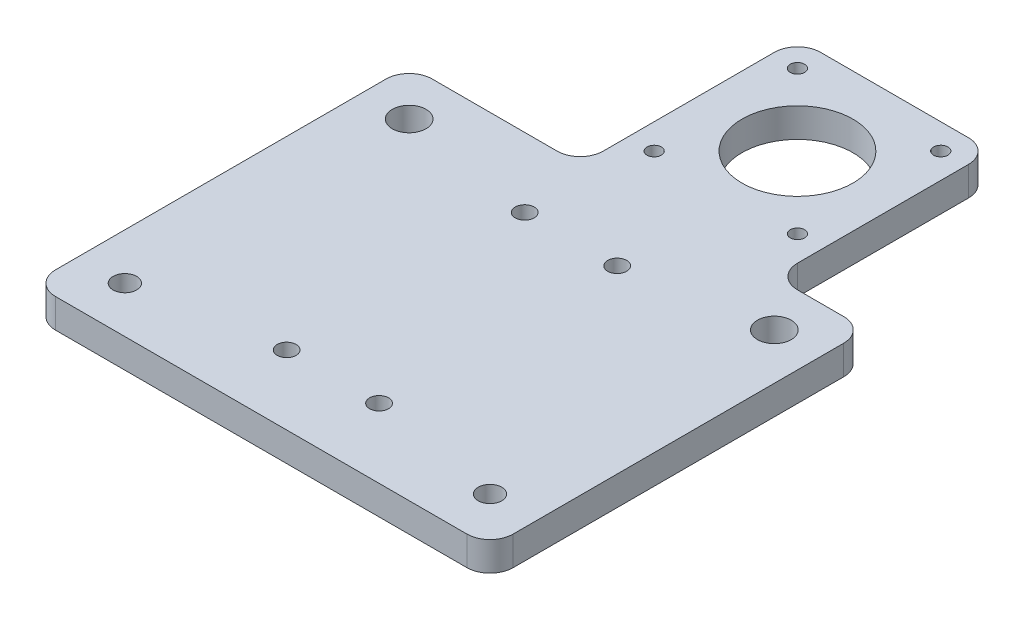
ISO-10303-21;
HEADER;
FILE_DESCRIPTION(('STEP AP214'),'2;1');
FILE_NAME('part.step','',(''),(''),'','','');
FILE_SCHEMA(('AUTOMOTIVE_DESIGN { 1 0 10303 214 1 1 1 1 }'));
ENDSEC;
DATA;
#1=APPLICATION_CONTEXT('core data for automotive mechanical design processes');
#2=APPLICATION_PROTOCOL_DEFINITION('international standard','automotive_design',2000,#1);
#3=PRODUCT_CONTEXT('',#1,'mechanical');
#4=PRODUCT('Part','Part','',(#3));
#5=PRODUCT_RELATED_PRODUCT_CATEGORY('part','',(#4));
#6=PRODUCT_DEFINITION_FORMATION('','',#4);
#7=PRODUCT_DEFINITION_CONTEXT('part definition',#1,'design');
#8=PRODUCT_DEFINITION('design','',#6,#7);
#9=PRODUCT_DEFINITION_SHAPE('','',#8);
#10=(LENGTH_UNIT() NAMED_UNIT(*) SI_UNIT(.MILLI.,.METRE.));
#11=(NAMED_UNIT(*) PLANE_ANGLE_UNIT() SI_UNIT($,.RADIAN.));
#12=(NAMED_UNIT(*) SI_UNIT($,.STERADIAN.) SOLID_ANGLE_UNIT());
#13=UNCERTAINTY_MEASURE_WITH_UNIT(LENGTH_MEASURE(1.E-05),#10,'distance_accuracy_value','');
#14=(GEOMETRIC_REPRESENTATION_CONTEXT(3) GLOBAL_UNCERTAINTY_ASSIGNED_CONTEXT((#13)) GLOBAL_UNIT_ASSIGNED_CONTEXT((#10,
#11,#12)) REPRESENTATION_CONTEXT('',''));
#15=CARTESIAN_POINT('',(0.,0.,0.));
#16=DIRECTION('',(0.,0.,1.));
#17=DIRECTION('',(1.,0.,0.));
#18=AXIS2_PLACEMENT_3D('',#15,#16,#17);
#19=CARTESIAN_POINT('',(0.,6.3,0.));
#20=DIRECTION('',(0.,1.,0.));
#21=DIRECTION('',(0.,0.,1.));
#22=AXIS2_PLACEMENT_3D('',#19,#20,#21);
#23=PLANE('',#22);
#24=CARTESIAN_POINT('',(60.,6.3,-15.));
#25=DIRECTION('',(0.,1.,0.));
#26=DIRECTION('',(0.,0.,1.));
#27=AXIS2_PLACEMENT_3D('',#24,#25,#26);
#28=CIRCLE('',#27,2.04999999999999);
#29=CARTESIAN_POINT('',(60.,6.3,-12.95));
#30=VERTEX_POINT('',#29);
#31=EDGE_CURVE('E348',#30,#30,#28,.T.);
#32=ORIENTED_EDGE('',*,*,#31,.F.);
#33=EDGE_LOOP('',(#32));
#34=FACE_BOUND('',#33,.T.);
#35=CARTESIAN_POINT('',(40.,6.3,-66.5));
#36=DIRECTION('',(0.,1.,0.));
#37=DIRECTION('',(0.,0.,1.));
#38=AXIS2_PLACEMENT_3D('',#35,#36,#37);
#39=CIRCLE('',#38,2.05);
#40=CARTESIAN_POINT('',(40.,6.3,-64.45));
#41=VERTEX_POINT('',#40);
#42=EDGE_CURVE('E336',#41,#41,#39,.T.);
#43=ORIENTED_EDGE('',*,*,#42,.F.);
#44=EDGE_LOOP('',(#43));
#45=FACE_BOUND('',#44,.T.);
#46=CARTESIAN_POINT('',(89.,6.3,-10.));
#47=DIRECTION('',(0.,1.,0.));
#48=DIRECTION('',(0.,0.,1.));
#49=AXIS2_PLACEMENT_3D('',#46,#47,#48);
#50=CIRCLE('',#49,2.54999999999999);
#51=CARTESIAN_POINT('',(89.,6.3,-7.45000000000001));
#52=VERTEX_POINT('',#51);
#53=EDGE_CURVE('E324',#52,#52,#50,.T.);
#54=ORIENTED_EDGE('',*,*,#53,.F.);
#55=EDGE_LOOP('',(#54));
#56=FACE_BOUND('',#55,.T.);
#57=CARTESIAN_POINT('',(42.5,6.3,-92.));
#58=DIRECTION('',(0.,1.,0.));
#59=DIRECTION('',(0.,0.,1.));
#60=AXIS2_PLACEMENT_3D('',#57,#58,#59);
#61=CIRCLE('',#60,1.54999999999999);
#62=CARTESIAN_POINT('',(42.5,6.3,-90.45));
#63=VERTEX_POINT('',#62);
#64=EDGE_CURVE('E312',#63,#63,#61,.T.);
#65=ORIENTED_EDGE('',*,*,#64,.F.);
#66=EDGE_LOOP('',(#65));
#67=FACE_BOUND('',#66,.T.);
#68=CARTESIAN_POINT('',(73.5,6.3,-123.));
#69=DIRECTION('',(0.,1.,0.));
#70=DIRECTION('',(0.,0.,1.));
#71=AXIS2_PLACEMENT_3D('',#68,#69,#70);
#72=CIRCLE('',#71,1.54999999999999);
#73=CARTESIAN_POINT('',(73.5,6.3,-121.45));
#74=VERTEX_POINT('',#73);
#75=EDGE_CURVE('E300',#74,#74,#72,.T.);
#76=ORIENTED_EDGE('',*,*,#75,.F.);
#77=EDGE_LOOP('',(#76));
#78=FACE_BOUND('',#77,.T.);
#79=CARTESIAN_POINT('',(58.,6.3,-107.5));
#80=DIRECTION('',(0.,1.,0.));
#81=DIRECTION('',(0.,0.,1.));
#82=AXIS2_PLACEMENT_3D('',#79,#80,#81);
#83=CIRCLE('',#82,12.);
#84=CARTESIAN_POINT('',(58.,6.3,-95.5));
#85=VERTEX_POINT('',#84);
#86=EDGE_CURVE('E288',#85,#85,#83,.T.);
#87=ORIENTED_EDGE('',*,*,#86,.F.);
#88=EDGE_LOOP('',(#87));
#89=FACE_BOUND('',#88,.T.);
#90=DIRECTION('',(0.,0.,1.));
#91=VECTOR('',#90,1.);
#92=CARTESIAN_POINT('',(0.,6.3,0.));
#93=LINE('',#92,#91);
#94=CARTESIAN_POINT('',(0.,6.3,-76.5));
#95=VERTEX_POINT('',#94);
#96=CARTESIAN_POINT('',(0.,6.3,-5.));
#97=VERTEX_POINT('',#96);
#98=EDGE_CURVE('E197',#95,#97,#93,.T.);
#99=ORIENTED_EDGE('',*,*,#98,.T.);
#100=CARTESIAN_POINT('',(5.,6.3,-5.));
#101=DIRECTION('',(0.,1.,0.));
#102=DIRECTION('',(0.,0.,1.));
#103=AXIS2_PLACEMENT_3D('',#100,#101,#102);
#104=CIRCLE('',#103,5.);
#105=CARTESIAN_POINT('',(5.,6.3,0.));
#106=VERTEX_POINT('',#105);
#107=EDGE_CURVE('E221',#97,#106,#104,.T.);
#108=ORIENTED_EDGE('',*,*,#107,.T.);
#109=DIRECTION('',(1.,0.,0.));
#110=VECTOR('',#109,1.);
#111=CARTESIAN_POINT('',(0.,6.3,0.));
#112=LINE('',#111,#110);
#113=CARTESIAN_POINT('',(94.,6.3,0.));
#114=VERTEX_POINT('',#113);
#115=EDGE_CURVE('E167',#106,#114,#112,.T.);
#116=ORIENTED_EDGE('',*,*,#115,.T.);
#117=CARTESIAN_POINT('',(94.,6.3,-5.));
#118=DIRECTION('',(0.,1.,0.));
#119=DIRECTION('',(0.,0.,1.));
#120=AXIS2_PLACEMENT_3D('',#117,#118,#119);
#121=CIRCLE('',#120,5.);
#122=CARTESIAN_POINT('',(99.,6.3,-5.));
#123=VERTEX_POINT('',#122);
#124=EDGE_CURVE('E219',#114,#123,#121,.T.);
#125=ORIENTED_EDGE('',*,*,#124,.T.);
#126=DIRECTION('',(0.,0.,-1.));
#127=VECTOR('',#126,1.);
#128=CARTESIAN_POINT('',(99.,6.3,0.));
#129=LINE('',#128,#127);
#130=CARTESIAN_POINT('',(99.,6.3,-76.5));
#131=VERTEX_POINT('',#130);
#132=EDGE_CURVE('E279',#123,#131,#129,.T.);
#133=ORIENTED_EDGE('',*,*,#132,.T.);
#134=CARTESIAN_POINT('',(94.,6.3,-76.5));
#135=DIRECTION('',(0.,1.,0.));
#136=DIRECTION('',(0.,0.,1.));
#137=AXIS2_PLACEMENT_3D('',#134,#135,#136);
#138=CIRCLE('',#137,5.);
#139=CARTESIAN_POINT('',(94.,6.3,-81.5));
#140=VERTEX_POINT('',#139);
#141=EDGE_CURVE('E217',#131,#140,#138,.T.);
#142=ORIENTED_EDGE('',*,*,#141,.T.);
#143=DIRECTION('',(-1.,0.,0.));
#144=VECTOR('',#143,1.);
#145=CARTESIAN_POINT('',(79.,6.3,-81.5));
#146=LINE('',#145,#144);
#147=CARTESIAN_POINT('',(84.,6.3,-81.5));
#148=VERTEX_POINT('',#147);
#149=EDGE_CURVE('E276',#140,#148,#146,.T.);
#150=ORIENTED_EDGE('',*,*,#149,.T.);
#151=CARTESIAN_POINT('',(84.,6.3,-86.5));
#152=DIRECTION('',(0.,1.,0.));
#153=DIRECTION('',(0.,0.,1.));
#154=AXIS2_PLACEMENT_3D('',#151,#152,#153);
#155=CIRCLE('',#154,5.);
#156=CARTESIAN_POINT('',(79.,6.3,-86.5));
#157=VERTEX_POINT('',#156);
#158=EDGE_CURVE('E254',#148,#157,#155,.F.);
#159=ORIENTED_EDGE('',*,*,#158,.T.);
#160=DIRECTION('',(0.,0.,-1.));
#161=VECTOR('',#160,1.);
#162=CARTESIAN_POINT('',(79.,6.3,-81.5));
#163=LINE('',#162,#161);
#164=CARTESIAN_POINT('',(79.,6.3,-123.5));
#165=VERTEX_POINT('',#164);
#166=EDGE_CURVE('E273',#157,#165,#163,.T.);
#167=ORIENTED_EDGE('',*,*,#166,.T.);
#168=CARTESIAN_POINT('',(74.,6.3,-123.5));
#169=DIRECTION('',(0.,1.,0.));
#170=DIRECTION('',(0.,0.,1.));
#171=AXIS2_PLACEMENT_3D('',#168,#169,#170);
#172=CIRCLE('',#171,5.);
#173=CARTESIAN_POINT('',(74.,6.3,-128.5));
#174=VERTEX_POINT('',#173);
#175=EDGE_CURVE('E215',#165,#174,#172,.T.);
#176=ORIENTED_EDGE('',*,*,#175,.T.);
#177=DIRECTION('',(-1.,0.,0.));
#178=VECTOR('',#177,1.);
#179=CARTESIAN_POINT('',(37.,6.3,-128.5));
#180=LINE('',#179,#178);
#181=CARTESIAN_POINT('',(42.,6.3,-128.5));
#182=VERTEX_POINT('',#181);
#183=EDGE_CURVE('E268',#174,#182,#180,.T.);
#184=ORIENTED_EDGE('',*,*,#183,.T.);
#185=CARTESIAN_POINT('',(42.,6.3,-123.5));
#186=DIRECTION('',(0.,1.,0.));
#187=DIRECTION('',(0.,0.,1.));
#188=AXIS2_PLACEMENT_3D('',#185,#186,#187);
#189=CIRCLE('',#188,5.);
#190=CARTESIAN_POINT('',(37.,6.3,-123.5));
#191=VERTEX_POINT('',#190);
#192=EDGE_CURVE('E213',#182,#191,#189,.T.);
#193=ORIENTED_EDGE('',*,*,#192,.T.);
#194=DIRECTION('',(0.,0.,1.));
#195=VECTOR('',#194,1.);
#196=CARTESIAN_POINT('',(37.,6.3,-81.5));
#197=LINE('',#196,#195);
#198=CARTESIAN_POINT('',(37.,6.3,-86.5));
#199=VERTEX_POINT('',#198);
#200=EDGE_CURVE('E267',#191,#199,#197,.T.);
#201=ORIENTED_EDGE('',*,*,#200,.T.);
#202=CARTESIAN_POINT('',(32.,6.3,-86.5));
#203=DIRECTION('',(0.,1.,0.));
#204=DIRECTION('',(0.,0.,1.));
#205=AXIS2_PLACEMENT_3D('',#202,#203,#204);
#206=CIRCLE('',#205,5.);
#207=CARTESIAN_POINT('',(32.,6.3,-81.5));
#208=VERTEX_POINT('',#207);
#209=EDGE_CURVE('E11',#199,#208,#206,.F.);
#210=ORIENTED_EDGE('',*,*,#209,.T.);
#211=DIRECTION('',(-1.,0.,0.));
#212=VECTOR('',#211,1.);
#213=CARTESIAN_POINT('',(37.,6.3,-81.5));
#214=LINE('',#213,#212);
#215=CARTESIAN_POINT('',(5.,6.3,-81.5));
#216=VERTEX_POINT('',#215);
#217=EDGE_CURVE('E198',#208,#216,#214,.T.);
#218=ORIENTED_EDGE('',*,*,#217,.T.);
#219=CARTESIAN_POINT('',(5.,6.3,-76.5));
#220=DIRECTION('',(0.,1.,0.));
#221=DIRECTION('',(0.,0.,1.));
#222=AXIS2_PLACEMENT_3D('',#219,#220,#221);
#223=CIRCLE('',#222,5.);
#224=EDGE_CURVE('E211',#216,#95,#223,.T.);
#225=ORIENTED_EDGE('',*,*,#224,.T.);
#226=EDGE_LOOP('',(#99,#108,#116,#125,#133,#142,#150,#159,#167,#176,#184,#193,#201,#210,#218,#225));
#227=FACE_BOUND('',#226,.T.);
#228=CARTESIAN_POINT('',(10.,6.3,-71.5));
#229=DIRECTION('',(0.,1.,0.));
#230=DIRECTION('',(0.,0.,1.));
#231=AXIS2_PLACEMENT_3D('',#228,#229,#230);
#232=CIRCLE('',#231,3.65);
#233=CARTESIAN_POINT('',(10.,6.3,-67.85));
#234=VERTEX_POINT('',#233);
#235=EDGE_CURVE('E180',#234,#234,#232,.T.);
#236=ORIENTED_EDGE('',*,*,#235,.F.);
#237=EDGE_LOOP('',(#236));
#238=FACE_BOUND('',#237,.T.);
#239=CARTESIAN_POINT('',(42.5,6.3,-123.));
#240=DIRECTION('',(0.,1.,0.));
#241=DIRECTION('',(0.,0.,1.));
#242=AXIS2_PLACEMENT_3D('',#239,#240,#241);
#243=CIRCLE('',#242,1.55);
#244=CARTESIAN_POINT('',(42.5,6.3,-121.45));
#245=VERTEX_POINT('',#244);
#246=EDGE_CURVE('E294',#245,#245,#243,.T.);
#247=ORIENTED_EDGE('',*,*,#246,.F.);
#248=EDGE_LOOP('',(#247));
#249=FACE_BOUND('',#248,.T.);
#250=CARTESIAN_POINT('',(73.5,6.3,-92.));
#251=DIRECTION('',(0.,1.,0.));
#252=DIRECTION('',(0.,0.,1.));
#253=AXIS2_PLACEMENT_3D('',#250,#251,#252);
#254=CIRCLE('',#253,1.54999999999999);
#255=CARTESIAN_POINT('',(73.5,6.3,-90.45));
#256=VERTEX_POINT('',#255);
#257=EDGE_CURVE('E306',#256,#256,#254,.T.);
#258=ORIENTED_EDGE('',*,*,#257,.F.);
#259=EDGE_LOOP('',(#258));
#260=FACE_BOUND('',#259,.T.);
#261=CARTESIAN_POINT('',(89.,6.3,-71.5));
#262=DIRECTION('',(0.,1.,0.));
#263=DIRECTION('',(0.,0.,1.));
#264=AXIS2_PLACEMENT_3D('',#261,#262,#263);
#265=CIRCLE('',#264,3.65);
#266=CARTESIAN_POINT('',(89.,6.3,-67.85));
#267=VERTEX_POINT('',#266);
#268=EDGE_CURVE('E318',#267,#267,#265,.T.);
#269=ORIENTED_EDGE('',*,*,#268,.F.);
#270=EDGE_LOOP('',(#269));
#271=FACE_BOUND('',#270,.T.);
#272=CARTESIAN_POINT('',(10.,6.3,-9.99999999999999));
#273=DIRECTION('',(0.,1.,0.));
#274=DIRECTION('',(0.,0.,1.));
#275=AXIS2_PLACEMENT_3D('',#272,#273,#274);
#276=CIRCLE('',#275,2.55);
#277=CARTESIAN_POINT('',(10.,6.3,-7.44999999999999));
#278=VERTEX_POINT('',#277);
#279=EDGE_CURVE('E330',#278,#278,#276,.T.);
#280=ORIENTED_EDGE('',*,*,#279,.F.);
#281=EDGE_LOOP('',(#280));
#282=FACE_BOUND('',#281,.T.);
#283=CARTESIAN_POINT('',(60.,6.3,-66.5));
#284=DIRECTION('',(0.,1.,0.));
#285=DIRECTION('',(0.,0.,1.));
#286=AXIS2_PLACEMENT_3D('',#283,#284,#285);
#287=CIRCLE('',#286,2.05);
#288=CARTESIAN_POINT('',(60.,6.3,-64.45));
#289=VERTEX_POINT('',#288);
#290=EDGE_CURVE('E342',#289,#289,#287,.T.);
#291=ORIENTED_EDGE('',*,*,#290,.F.);
#292=EDGE_LOOP('',(#291));
#293=FACE_BOUND('',#292,.T.);
#294=CARTESIAN_POINT('',(40.,6.3,-15.));
#295=DIRECTION('',(0.,1.,0.));
#296=DIRECTION('',(0.,0.,1.));
#297=AXIS2_PLACEMENT_3D('',#294,#295,#296);
#298=CIRCLE('',#297,2.05);
#299=CARTESIAN_POINT('',(40.,6.3,-12.95));
#300=VERTEX_POINT('',#299);
#301=EDGE_CURVE('E354',#300,#300,#298,.T.);
#302=ORIENTED_EDGE('',*,*,#301,.F.);
#303=EDGE_LOOP('',(#302));
#304=FACE_BOUND('',#303,.T.);
#305=ADVANCED_FACE('F34',(#34,#45,#56,#67,#78,#89,#227,#238,#249,#260,#271,#282,#293,#304),#23,.T.);
#306=CARTESIAN_POINT('',(0.,0.,0.));
#307=DIRECTION('',(0.,1.,0.));
#308=DIRECTION('',(0.,0.,1.));
#309=AXIS2_PLACEMENT_3D('',#306,#307,#308);
#310=PLANE('',#309);
#311=DIRECTION('',(1.,0.,0.));
#312=VECTOR('',#311,1.);
#313=CARTESIAN_POINT('',(0.,0.,0.));
#314=LINE('',#313,#312);
#315=CARTESIAN_POINT('',(5.,0.,0.));
#316=VERTEX_POINT('',#315);
#317=CARTESIAN_POINT('',(94.,0.,0.));
#318=VERTEX_POINT('',#317);
#319=EDGE_CURVE('E164',#316,#318,#314,.T.);
#320=ORIENTED_EDGE('',*,*,#319,.F.);
#321=CARTESIAN_POINT('',(5.,0.,-5.));
#322=DIRECTION('',(0.,1.,0.));
#323=DIRECTION('',(0.,0.,1.));
#324=AXIS2_PLACEMENT_3D('',#321,#322,#323);
#325=CIRCLE('',#324,5.);
#326=CARTESIAN_POINT('',(0.,0.,-5.));
#327=VERTEX_POINT('',#326);
#328=EDGE_CURVE('E147',#316,#327,#325,.F.);
#329=ORIENTED_EDGE('',*,*,#328,.T.);
#330=DIRECTION('',(0.,0.,1.));
#331=VECTOR('',#330,1.);
#332=CARTESIAN_POINT('',(0.,0.,0.));
#333=LINE('',#332,#331);
#334=CARTESIAN_POINT('',(0.,0.,-76.5));
#335=VERTEX_POINT('',#334);
#336=EDGE_CURVE('E175',#335,#327,#333,.T.);
#337=ORIENTED_EDGE('',*,*,#336,.F.);
#338=CARTESIAN_POINT('',(5.,0.,-76.5));
#339=DIRECTION('',(0.,1.,0.));
#340=DIRECTION('',(0.,0.,1.));
#341=AXIS2_PLACEMENT_3D('',#338,#339,#340);
#342=CIRCLE('',#341,5.);
#343=CARTESIAN_POINT('',(5.,0.,-81.5));
#344=VERTEX_POINT('',#343);
#345=EDGE_CURVE('E168',#335,#344,#342,.F.);
#346=ORIENTED_EDGE('',*,*,#345,.T.);
#347=DIRECTION('',(-1.,0.,0.));
#348=VECTOR('',#347,1.);
#349=CARTESIAN_POINT('',(37.,0.,-81.5));
#350=LINE('',#349,#348);
#351=CARTESIAN_POINT('',(32.,0.,-81.5));
#352=VERTEX_POINT('',#351);
#353=EDGE_CURVE('E195',#352,#344,#350,.T.);
#354=ORIENTED_EDGE('',*,*,#353,.F.);
#355=CARTESIAN_POINT('',(32.,0.,-86.5));
#356=DIRECTION('',(0.,1.,0.));
#357=DIRECTION('',(0.,0.,1.));
#358=AXIS2_PLACEMENT_3D('',#355,#356,#357);
#359=CIRCLE('',#358,5.);
#360=CARTESIAN_POINT('',(37.,0.,-86.5));
#361=VERTEX_POINT('',#360);
#362=EDGE_CURVE('E42',#352,#361,#359,.T.);
#363=ORIENTED_EDGE('',*,*,#362,.T.);
#364=DIRECTION('',(0.,0.,1.));
#365=VECTOR('',#364,1.);
#366=CARTESIAN_POINT('',(37.,0.,-81.5));
#367=LINE('',#366,#365);
#368=CARTESIAN_POINT('',(37.,0.,-123.5));
#369=VERTEX_POINT('',#368);
#370=EDGE_CURVE('E192',#369,#361,#367,.T.);
#371=ORIENTED_EDGE('',*,*,#370,.F.);
#372=CARTESIAN_POINT('',(42.,0.,-123.5));
#373=DIRECTION('',(0.,1.,0.));
#374=DIRECTION('',(0.,0.,1.));
#375=AXIS2_PLACEMENT_3D('',#372,#373,#374);
#376=CIRCLE('',#375,5.);
#377=CARTESIAN_POINT('',(42.,0.,-128.5));
#378=VERTEX_POINT('',#377);
#379=EDGE_CURVE('E201',#369,#378,#376,.F.);
#380=ORIENTED_EDGE('',*,*,#379,.T.);
#381=DIRECTION('',(-1.,0.,0.));
#382=VECTOR('',#381,1.);
#383=CARTESIAN_POINT('',(37.,0.,-128.5));
#384=LINE('',#383,#382);
#385=CARTESIAN_POINT('',(74.,0.,-128.5));
#386=VERTEX_POINT('',#385);
#387=EDGE_CURVE('E189',#386,#378,#384,.T.);
#388=ORIENTED_EDGE('',*,*,#387,.F.);
#389=CARTESIAN_POINT('',(74.,0.,-123.5));
#390=DIRECTION('',(0.,1.,0.));
#391=DIRECTION('',(0.,0.,1.));
#392=AXIS2_PLACEMENT_3D('',#389,#390,#391);
#393=CIRCLE('',#392,5.);
#394=CARTESIAN_POINT('',(79.,0.,-123.5));
#395=VERTEX_POINT('',#394);
#396=EDGE_CURVE('E203',#386,#395,#393,.F.);
#397=ORIENTED_EDGE('',*,*,#396,.T.);
#398=DIRECTION('',(0.,0.,-1.));
#399=VECTOR('',#398,1.);
#400=CARTESIAN_POINT('',(79.,0.,-81.5));
#401=LINE('',#400,#399);
#402=CARTESIAN_POINT('',(79.,0.,-86.5));
#403=VERTEX_POINT('',#402);
#404=EDGE_CURVE('E186',#403,#395,#401,.T.);
#405=ORIENTED_EDGE('',*,*,#404,.F.);
#406=CARTESIAN_POINT('',(84.,0.,-86.5));
#407=DIRECTION('',(0.,1.,0.));
#408=DIRECTION('',(0.,0.,1.));
#409=AXIS2_PLACEMENT_3D('',#406,#407,#408);
#410=CIRCLE('',#409,5.);
#411=CARTESIAN_POINT('',(84.,0.,-81.5));
#412=VERTEX_POINT('',#411);
#413=EDGE_CURVE('E252',#403,#412,#410,.T.);
#414=ORIENTED_EDGE('',*,*,#413,.T.);
#415=DIRECTION('',(-1.,0.,0.));
#416=VECTOR('',#415,1.);
#417=CARTESIAN_POINT('',(79.,0.,-81.5));
#418=LINE('',#417,#416);
#419=CARTESIAN_POINT('',(94.,0.,-81.5));
#420=VERTEX_POINT('',#419);
#421=EDGE_CURVE('E178',#420,#412,#418,.T.);
#422=ORIENTED_EDGE('',*,*,#421,.F.);
#423=CARTESIAN_POINT('',(94.,0.,-76.5));
#424=DIRECTION('',(0.,1.,0.));
#425=DIRECTION('',(0.,0.,1.));
#426=AXIS2_PLACEMENT_3D('',#423,#424,#425);
#427=CIRCLE('',#426,5.);
#428=CARTESIAN_POINT('',(99.,0.,-76.5));
#429=VERTEX_POINT('',#428);
#430=EDGE_CURVE('E205',#420,#429,#427,.F.);
#431=ORIENTED_EDGE('',*,*,#430,.T.);
#432=DIRECTION('',(0.,0.,-1.));
#433=VECTOR('',#432,1.);
#434=CARTESIAN_POINT('',(99.,0.,0.));
#435=LINE('',#434,#433);
#436=CARTESIAN_POINT('',(99.,0.,-5.));
#437=VERTEX_POINT('',#436);
#438=EDGE_CURVE('E174',#437,#429,#435,.T.);
#439=ORIENTED_EDGE('',*,*,#438,.F.);
#440=CARTESIAN_POINT('',(94.,0.,-5.));
#441=DIRECTION('',(0.,1.,0.));
#442=DIRECTION('',(0.,0.,1.));
#443=AXIS2_PLACEMENT_3D('',#440,#441,#442);
#444=CIRCLE('',#443,5.);
#445=EDGE_CURVE('E158',#437,#318,#444,.F.);
#446=ORIENTED_EDGE('',*,*,#445,.T.);
#447=EDGE_LOOP('',(#320,#329,#337,#346,#354,#363,#371,#380,#388,#397,#405,#414,#422,#431,#439,#446));
#448=FACE_BOUND('',#447,.T.);
#449=CARTESIAN_POINT('',(10.,0.,-71.5));
#450=DIRECTION('',(0.,1.,0.));
#451=DIRECTION('',(0.,0.,1.));
#452=AXIS2_PLACEMENT_3D('',#449,#450,#451);
#453=CIRCLE('',#452,3.65);
#454=CARTESIAN_POINT('',(10.,0.,-67.85));
#455=VERTEX_POINT('',#454);
#456=EDGE_CURVE('E285',#455,#455,#453,.T.);
#457=ORIENTED_EDGE('',*,*,#456,.T.);
#458=EDGE_LOOP('',(#457));
#459=FACE_BOUND('',#458,.T.);
#460=CARTESIAN_POINT('',(58.,0.,-107.5));
#461=DIRECTION('',(0.,1.,0.));
#462=DIRECTION('',(0.,0.,1.));
#463=AXIS2_PLACEMENT_3D('',#460,#461,#462);
#464=CIRCLE('',#463,12.);
#465=CARTESIAN_POINT('',(58.,0.,-95.5));
#466=VERTEX_POINT('',#465);
#467=EDGE_CURVE('E291',#466,#466,#464,.T.);
#468=ORIENTED_EDGE('',*,*,#467,.T.);
#469=EDGE_LOOP('',(#468));
#470=FACE_BOUND('',#469,.T.);
#471=CARTESIAN_POINT('',(42.5,0.,-123.));
#472=DIRECTION('',(0.,1.,0.));
#473=DIRECTION('',(0.,0.,1.));
#474=AXIS2_PLACEMENT_3D('',#471,#472,#473);
#475=CIRCLE('',#474,1.55);
#476=CARTESIAN_POINT('',(42.5,0.,-121.45));
#477=VERTEX_POINT('',#476);
#478=EDGE_CURVE('E297',#477,#477,#475,.T.);
#479=ORIENTED_EDGE('',*,*,#478,.T.);
#480=EDGE_LOOP('',(#479));
#481=FACE_BOUND('',#480,.T.);
#482=CARTESIAN_POINT('',(73.5,0.,-123.));
#483=DIRECTION('',(0.,1.,0.));
#484=DIRECTION('',(0.,0.,1.));
#485=AXIS2_PLACEMENT_3D('',#482,#483,#484);
#486=CIRCLE('',#485,1.54999999999999);
#487=CARTESIAN_POINT('',(73.5,0.,-121.45));
#488=VERTEX_POINT('',#487);
#489=EDGE_CURVE('E303',#488,#488,#486,.T.);
#490=ORIENTED_EDGE('',*,*,#489,.T.);
#491=EDGE_LOOP('',(#490));
#492=FACE_BOUND('',#491,.T.);
#493=CARTESIAN_POINT('',(73.5,0.,-92.));
#494=DIRECTION('',(0.,1.,0.));
#495=DIRECTION('',(0.,0.,1.));
#496=AXIS2_PLACEMENT_3D('',#493,#494,#495);
#497=CIRCLE('',#496,1.54999999999999);
#498=CARTESIAN_POINT('',(73.5,0.,-90.45));
#499=VERTEX_POINT('',#498);
#500=EDGE_CURVE('E309',#499,#499,#497,.T.);
#501=ORIENTED_EDGE('',*,*,#500,.T.);
#502=EDGE_LOOP('',(#501));
#503=FACE_BOUND('',#502,.T.);
#504=CARTESIAN_POINT('',(42.5,0.,-92.));
#505=DIRECTION('',(0.,1.,0.));
#506=DIRECTION('',(0.,0.,1.));
#507=AXIS2_PLACEMENT_3D('',#504,#505,#506);
#508=CIRCLE('',#507,1.54999999999999);
#509=CARTESIAN_POINT('',(42.5,0.,-90.45));
#510=VERTEX_POINT('',#509);
#511=EDGE_CURVE('E315',#510,#510,#508,.T.);
#512=ORIENTED_EDGE('',*,*,#511,.T.);
#513=EDGE_LOOP('',(#512));
#514=FACE_BOUND('',#513,.T.);
#515=CARTESIAN_POINT('',(89.,0.,-71.5));
#516=DIRECTION('',(0.,1.,0.));
#517=DIRECTION('',(0.,0.,1.));
#518=AXIS2_PLACEMENT_3D('',#515,#516,#517);
#519=CIRCLE('',#518,3.65);
#520=CARTESIAN_POINT('',(89.,0.,-67.85));
#521=VERTEX_POINT('',#520);
#522=EDGE_CURVE('E321',#521,#521,#519,.T.);
#523=ORIENTED_EDGE('',*,*,#522,.T.);
#524=EDGE_LOOP('',(#523));
#525=FACE_BOUND('',#524,.T.);
#526=CARTESIAN_POINT('',(89.,0.,-10.));
#527=DIRECTION('',(0.,1.,0.));
#528=DIRECTION('',(0.,0.,1.));
#529=AXIS2_PLACEMENT_3D('',#526,#527,#528);
#530=CIRCLE('',#529,2.54999999999999);
#531=CARTESIAN_POINT('',(89.,0.,-7.45000000000001));
#532=VERTEX_POINT('',#531);
#533=EDGE_CURVE('E327',#532,#532,#530,.T.);
#534=ORIENTED_EDGE('',*,*,#533,.T.);
#535=EDGE_LOOP('',(#534));
#536=FACE_BOUND('',#535,.T.);
#537=CARTESIAN_POINT('',(10.,0.,-9.99999999999999));
#538=DIRECTION('',(0.,1.,0.));
#539=DIRECTION('',(0.,0.,1.));
#540=AXIS2_PLACEMENT_3D('',#537,#538,#539);
#541=CIRCLE('',#540,2.55);
#542=CARTESIAN_POINT('',(10.,0.,-7.44999999999999));
#543=VERTEX_POINT('',#542);
#544=EDGE_CURVE('E333',#543,#543,#541,.T.);
#545=ORIENTED_EDGE('',*,*,#544,.T.);
#546=EDGE_LOOP('',(#545));
#547=FACE_BOUND('',#546,.T.);
#548=CARTESIAN_POINT('',(40.,0.,-66.5));
#549=DIRECTION('',(0.,1.,0.));
#550=DIRECTION('',(0.,0.,1.));
#551=AXIS2_PLACEMENT_3D('',#548,#549,#550);
#552=CIRCLE('',#551,2.05);
#553=CARTESIAN_POINT('',(40.,0.,-64.45));
#554=VERTEX_POINT('',#553);
#555=EDGE_CURVE('E339',#554,#554,#552,.T.);
#556=ORIENTED_EDGE('',*,*,#555,.T.);
#557=EDGE_LOOP('',(#556));
#558=FACE_BOUND('',#557,.T.);
#559=CARTESIAN_POINT('',(60.,0.,-66.5));
#560=DIRECTION('',(0.,1.,0.));
#561=DIRECTION('',(0.,0.,1.));
#562=AXIS2_PLACEMENT_3D('',#559,#560,#561);
#563=CIRCLE('',#562,2.05);
#564=CARTESIAN_POINT('',(60.,0.,-64.45));
#565=VERTEX_POINT('',#564);
#566=EDGE_CURVE('E345',#565,#565,#563,.T.);
#567=ORIENTED_EDGE('',*,*,#566,.T.);
#568=EDGE_LOOP('',(#567));
#569=FACE_BOUND('',#568,.T.);
#570=CARTESIAN_POINT('',(60.,0.,-15.));
#571=DIRECTION('',(0.,1.,0.));
#572=DIRECTION('',(0.,0.,1.));
#573=AXIS2_PLACEMENT_3D('',#570,#571,#572);
#574=CIRCLE('',#573,2.04999999999999);
#575=CARTESIAN_POINT('',(60.,0.,-12.95));
#576=VERTEX_POINT('',#575);
#577=EDGE_CURVE('E351',#576,#576,#574,.T.);
#578=ORIENTED_EDGE('',*,*,#577,.T.);
#579=EDGE_LOOP('',(#578));
#580=FACE_BOUND('',#579,.T.);
#581=CARTESIAN_POINT('',(40.,0.,-15.));
#582=DIRECTION('',(0.,1.,0.));
#583=DIRECTION('',(0.,0.,1.));
#584=AXIS2_PLACEMENT_3D('',#581,#582,#583);
#585=CIRCLE('',#584,2.05);
#586=CARTESIAN_POINT('',(40.,0.,-12.95));
#587=VERTEX_POINT('',#586);
#588=EDGE_CURVE('E357',#587,#587,#585,.T.);
#589=ORIENTED_EDGE('',*,*,#588,.T.);
#590=EDGE_LOOP('',(#589));
#591=FACE_BOUND('',#590,.T.);
#592=ADVANCED_FACE('F171',(#448,#459,#470,#481,#492,#503,#514,#525,#536,#547,#558,#569,#580,
#591),#310,.F.);
#593=CARTESIAN_POINT('',(0.,6.3,0.));
#594=DIRECTION('',(1.,0.,0.));
#595=DIRECTION('',(0.,0.,-1.));
#596=AXIS2_PLACEMENT_3D('',#593,#594,#595);
#597=PLANE('',#596);
#598=ORIENTED_EDGE('',*,*,#336,.T.);
#599=DIRECTION('',(0.,-1.,0.));
#600=VECTOR('',#599,1.);
#601=CARTESIAN_POINT('',(0.,6.3,-5.));
#602=LINE('',#601,#600);
#603=EDGE_CURVE('E152',#327,#97,#602,.F.);
#604=ORIENTED_EDGE('',*,*,#603,.T.);
#605=ORIENTED_EDGE('',*,*,#98,.F.);
#606=DIRECTION('',(0.,-1.,0.));
#607=VECTOR('',#606,1.);
#608=CARTESIAN_POINT('',(0.,6.3,-76.5));
#609=LINE('',#608,#607);
#610=EDGE_CURVE('E157',#95,#335,#609,.T.);
#611=ORIENTED_EDGE('',*,*,#610,.T.);
#612=EDGE_LOOP('',(#598,#604,#605,#611));
#613=FACE_BOUND('',#612,.T.);
#614=ADVANCED_FACE('F372',(#613),#597,.F.);
#615=CARTESIAN_POINT('',(0.,6.3,0.));
#616=DIRECTION('',(0.,0.,-1.));
#617=DIRECTION('',(-1.,0.,0.));
#618=AXIS2_PLACEMENT_3D('',#615,#616,#617);
#619=PLANE('',#618);
#620=ORIENTED_EDGE('',*,*,#115,.F.);
#621=DIRECTION('',(0.,-1.,0.));
#622=VECTOR('',#621,1.);
#623=CARTESIAN_POINT('',(5.,6.3,0.));
#624=LINE('',#623,#622);
#625=EDGE_CURVE('E151',#106,#316,#624,.T.);
#626=ORIENTED_EDGE('',*,*,#625,.T.);
#627=ORIENTED_EDGE('',*,*,#319,.T.);
#628=DIRECTION('',(0.,-1.,0.));
#629=VECTOR('',#628,1.);
#630=CARTESIAN_POINT('',(94.,6.3,0.));
#631=LINE('',#630,#629);
#632=EDGE_CURVE('E169',#318,#114,#631,.F.);
#633=ORIENTED_EDGE('',*,*,#632,.T.);
#634=EDGE_LOOP('',(#620,#626,#627,#633));
#635=FACE_BOUND('',#634,.T.);
#636=ADVANCED_FACE('F163',(#635),#619,.F.);
#637=CARTESIAN_POINT('',(99.,6.3,0.));
#638=DIRECTION('',(-1.,0.,0.));
#639=DIRECTION('',(0.,0.,1.));
#640=AXIS2_PLACEMENT_3D('',#637,#638,#639);
#641=PLANE('',#640);
#642=ORIENTED_EDGE('',*,*,#132,.F.);
#643=DIRECTION('',(0.,-1.,0.));
#644=VECTOR('',#643,1.);
#645=CARTESIAN_POINT('',(99.,6.3,-5.));
#646=LINE('',#645,#644);
#647=EDGE_CURVE('E225',#123,#437,#646,.T.);
#648=ORIENTED_EDGE('',*,*,#647,.T.);
#649=ORIENTED_EDGE('',*,*,#438,.T.);
#650=DIRECTION('',(0.,-1.,0.));
#651=VECTOR('',#650,1.);
#652=CARTESIAN_POINT('',(99.,6.3,-76.5));
#653=LINE('',#652,#651);
#654=EDGE_CURVE('E223',#429,#131,#653,.F.);
#655=ORIENTED_EDGE('',*,*,#654,.T.);
#656=EDGE_LOOP('',(#642,#648,#649,#655));
#657=FACE_BOUND('',#656,.T.);
#658=ADVANCED_FACE('F395',(#657),#641,.F.);
#659=CARTESIAN_POINT('',(79.,6.3,-81.5));
#660=DIRECTION('',(0.,0.,1.));
#661=DIRECTION('',(1.,0.,0.));
#662=AXIS2_PLACEMENT_3D('',#659,#660,#661);
#663=PLANE('',#662);
#664=ORIENTED_EDGE('',*,*,#149,.F.);
#665=DIRECTION('',(0.,-1.,0.));
#666=VECTOR('',#665,1.);
#667=CARTESIAN_POINT('',(94.,6.3,-81.5));
#668=LINE('',#667,#666);
#669=EDGE_CURVE('E230',#140,#420,#668,.T.);
#670=ORIENTED_EDGE('',*,*,#669,.T.);
#671=ORIENTED_EDGE('',*,*,#421,.T.);
#672=DIRECTION('',(0.,-1.,0.));
#673=VECTOR('',#672,1.);
#674=CARTESIAN_POINT('',(84.,6.3,-81.5));
#675=LINE('',#674,#673);
#676=EDGE_CURVE('E228',#412,#148,#675,.F.);
#677=ORIENTED_EDGE('',*,*,#676,.T.);
#678=EDGE_LOOP('',(#664,#670,#671,#677));
#679=FACE_BOUND('',#678,.T.);
#680=ADVANCED_FACE('F391',(#679),#663,.F.);
#681=CARTESIAN_POINT('',(79.,6.3,-81.5));
#682=DIRECTION('',(-1.,0.,0.));
#683=DIRECTION('',(0.,0.,1.));
#684=AXIS2_PLACEMENT_3D('',#681,#682,#683);
#685=PLANE('',#684);
#686=ORIENTED_EDGE('',*,*,#166,.F.);
#687=DIRECTION('',(0.,-1.,0.));
#688=VECTOR('',#687,1.);
#689=CARTESIAN_POINT('',(79.,0.,-86.5));
#690=LINE('',#689,#688);
#691=EDGE_CURVE('E235',#157,#403,#690,.T.);
#692=ORIENTED_EDGE('',*,*,#691,.T.);
#693=ORIENTED_EDGE('',*,*,#404,.T.);
#694=DIRECTION('',(0.,-1.,0.));
#695=VECTOR('',#694,1.);
#696=CARTESIAN_POINT('',(79.,6.3,-123.5));
#697=LINE('',#696,#695);
#698=EDGE_CURVE('E233',#395,#165,#697,.F.);
#699=ORIENTED_EDGE('',*,*,#698,.T.);
#700=EDGE_LOOP('',(#686,#692,#693,#699));
#701=FACE_BOUND('',#700,.T.);
#702=ADVANCED_FACE('F387',(#701),#685,.F.);
#703=CARTESIAN_POINT('',(37.,6.3,-128.5));
#704=DIRECTION('',(0.,0.,1.));
#705=DIRECTION('',(1.,0.,0.));
#706=AXIS2_PLACEMENT_3D('',#703,#704,#705);
#707=PLANE('',#706);
#708=ORIENTED_EDGE('',*,*,#183,.F.);
#709=DIRECTION('',(0.,-1.,0.));
#710=VECTOR('',#709,1.);
#711=CARTESIAN_POINT('',(74.,6.3,-128.5));
#712=LINE('',#711,#710);
#713=EDGE_CURVE('E240',#174,#386,#712,.T.);
#714=ORIENTED_EDGE('',*,*,#713,.T.);
#715=ORIENTED_EDGE('',*,*,#387,.T.);
#716=DIRECTION('',(0.,-1.,0.));
#717=VECTOR('',#716,1.);
#718=CARTESIAN_POINT('',(42.,6.3,-128.5));
#719=LINE('',#718,#717);
#720=EDGE_CURVE('E238',#378,#182,#719,.F.);
#721=ORIENTED_EDGE('',*,*,#720,.T.);
#722=EDGE_LOOP('',(#708,#714,#715,#721));
#723=FACE_BOUND('',#722,.T.);
#724=ADVANCED_FACE('F384',(#723),#707,.F.);
#725=CARTESIAN_POINT('',(37.,6.3,-81.5));
#726=DIRECTION('',(1.,0.,0.));
#727=DIRECTION('',(0.,0.,-1.));
#728=AXIS2_PLACEMENT_3D('',#725,#726,#727);
#729=PLANE('',#728);
#730=ORIENTED_EDGE('',*,*,#200,.F.);
#731=DIRECTION('',(0.,-1.,0.));
#732=VECTOR('',#731,1.);
#733=CARTESIAN_POINT('',(37.,6.3,-123.5));
#734=LINE('',#733,#732);
#735=EDGE_CURVE('E245',#191,#369,#734,.T.);
#736=ORIENTED_EDGE('',*,*,#735,.T.);
#737=ORIENTED_EDGE('',*,*,#370,.T.);
#738=DIRECTION('',(0.,-1.,0.));
#739=VECTOR('',#738,1.);
#740=CARTESIAN_POINT('',(37.,6.3,-86.5));
#741=LINE('',#740,#739);
#742=EDGE_CURVE('E243',#361,#199,#741,.F.);
#743=ORIENTED_EDGE('',*,*,#742,.T.);
#744=EDGE_LOOP('',(#730,#736,#737,#743));
#745=FACE_BOUND('',#744,.T.);
#746=ADVANCED_FACE('F262',(#745),#729,.F.);
#747=CARTESIAN_POINT('',(37.,6.3,-81.5));
#748=DIRECTION('',(0.,0.,1.));
#749=DIRECTION('',(1.,0.,0.));
#750=AXIS2_PLACEMENT_3D('',#747,#748,#749);
#751=PLANE('',#750);
#752=ORIENTED_EDGE('',*,*,#217,.F.);
#753=DIRECTION('',(0.,-1.,0.));
#754=VECTOR('',#753,1.);
#755=CARTESIAN_POINT('',(32.,0.,-81.5));
#756=LINE('',#755,#754);
#757=EDGE_CURVE('E249',#208,#352,#756,.T.);
#758=ORIENTED_EDGE('',*,*,#757,.T.);
#759=ORIENTED_EDGE('',*,*,#353,.T.);
#760=DIRECTION('',(0.,-1.,0.));
#761=VECTOR('',#760,1.);
#762=CARTESIAN_POINT('',(5.,6.3,-81.5));
#763=LINE('',#762,#761);
#764=EDGE_CURVE('E49',#344,#216,#763,.F.);
#765=ORIENTED_EDGE('',*,*,#764,.T.);
#766=EDGE_LOOP('',(#752,#758,#759,#765));
#767=FACE_BOUND('',#766,.T.);
#768=ADVANCED_FACE('F265',(#767),#751,.F.);
#769=CARTESIAN_POINT('',(10.,6.3,-71.5));
#770=DIRECTION('',(0.,-1.,0.));
#771=DIRECTION('',(0.,0.,-1.));
#772=AXIS2_PLACEMENT_3D('',#769,#770,#771);
#773=CYLINDRICAL_SURFACE('',#772,3.65);
#774=ORIENTED_EDGE('',*,*,#235,.T.);
#775=EDGE_LOOP('',(#774));
#776=FACE_BOUND('',#775,.T.);
#777=ORIENTED_EDGE('',*,*,#456,.F.);
#778=EDGE_LOOP('',(#777));
#779=FACE_BOUND('',#778,.T.);
#780=ADVANCED_FACE('F377',(#776,#779),#773,.F.);
#781=CARTESIAN_POINT('',(58.,6.3,-107.5));
#782=DIRECTION('',(0.,-1.,0.));
#783=DIRECTION('',(0.,0.,-1.));
#784=AXIS2_PLACEMENT_3D('',#781,#782,#783);
#785=CYLINDRICAL_SURFACE('',#784,12.);
#786=ORIENTED_EDGE('',*,*,#86,.T.);
#787=EDGE_LOOP('',(#786));
#788=FACE_BOUND('',#787,.T.);
#789=ORIENTED_EDGE('',*,*,#467,.F.);
#790=EDGE_LOOP('',(#789));
#791=FACE_BOUND('',#790,.T.);
#792=ADVANCED_FACE('F517',(#788,#791),#785,.F.);
#793=CARTESIAN_POINT('',(42.5,6.3,-123.));
#794=DIRECTION('',(0.,-1.,0.));
#795=DIRECTION('',(0.,0.,-1.));
#796=AXIS2_PLACEMENT_3D('',#793,#794,#795);
#797=CYLINDRICAL_SURFACE('',#796,1.55);
#798=ORIENTED_EDGE('',*,*,#246,.T.);
#799=EDGE_LOOP('',(#798));
#800=FACE_BOUND('',#799,.T.);
#801=ORIENTED_EDGE('',*,*,#478,.F.);
#802=EDGE_LOOP('',(#801));
#803=FACE_BOUND('',#802,.T.);
#804=ADVANCED_FACE('F514',(#800,#803),#797,.F.);
#805=CARTESIAN_POINT('',(73.5,6.3,-123.));
#806=DIRECTION('',(0.,-1.,0.));
#807=DIRECTION('',(0.,0.,-1.));
#808=AXIS2_PLACEMENT_3D('',#805,#806,#807);
#809=CYLINDRICAL_SURFACE('',#808,1.54999999999999);
#810=ORIENTED_EDGE('',*,*,#75,.T.);
#811=EDGE_LOOP('',(#810));
#812=FACE_BOUND('',#811,.T.);
#813=ORIENTED_EDGE('',*,*,#489,.F.);
#814=EDGE_LOOP('',(#813));
#815=FACE_BOUND('',#814,.T.);
#816=ADVANCED_FACE('F510',(#812,#815),#809,.F.);
#817=CARTESIAN_POINT('',(73.5,6.3,-92.));
#818=DIRECTION('',(0.,-1.,0.));
#819=DIRECTION('',(0.,0.,-1.));
#820=AXIS2_PLACEMENT_3D('',#817,#818,#819);
#821=CYLINDRICAL_SURFACE('',#820,1.54999999999999);
#822=ORIENTED_EDGE('',*,*,#257,.T.);
#823=EDGE_LOOP('',(#822));
#824=FACE_BOUND('',#823,.T.);
#825=ORIENTED_EDGE('',*,*,#500,.F.);
#826=EDGE_LOOP('',(#825));
#827=FACE_BOUND('',#826,.T.);
#828=ADVANCED_FACE('F506',(#824,#827),#821,.F.);
#829=CARTESIAN_POINT('',(42.5,6.3,-92.));
#830=DIRECTION('',(0.,-1.,0.));
#831=DIRECTION('',(0.,0.,-1.));
#832=AXIS2_PLACEMENT_3D('',#829,#830,#831);
#833=CYLINDRICAL_SURFACE('',#832,1.54999999999999);
#834=ORIENTED_EDGE('',*,*,#64,.T.);
#835=EDGE_LOOP('',(#834));
#836=FACE_BOUND('',#835,.T.);
#837=ORIENTED_EDGE('',*,*,#511,.F.);
#838=EDGE_LOOP('',(#837));
#839=FACE_BOUND('',#838,.T.);
#840=ADVANCED_FACE('F502',(#836,#839),#833,.F.);
#841=CARTESIAN_POINT('',(89.,6.3,-71.5));
#842=DIRECTION('',(0.,-1.,0.));
#843=DIRECTION('',(0.,0.,-1.));
#844=AXIS2_PLACEMENT_3D('',#841,#842,#843);
#845=CYLINDRICAL_SURFACE('',#844,3.65);
#846=ORIENTED_EDGE('',*,*,#268,.T.);
#847=EDGE_LOOP('',(#846));
#848=FACE_BOUND('',#847,.T.);
#849=ORIENTED_EDGE('',*,*,#522,.F.);
#850=EDGE_LOOP('',(#849));
#851=FACE_BOUND('',#850,.T.);
#852=ADVANCED_FACE('F498',(#848,#851),#845,.F.);
#853=CARTESIAN_POINT('',(89.,6.3,-10.));
#854=DIRECTION('',(0.,-1.,0.));
#855=DIRECTION('',(0.,0.,-1.));
#856=AXIS2_PLACEMENT_3D('',#853,#854,#855);
#857=CYLINDRICAL_SURFACE('',#856,2.54999999999999);
#858=ORIENTED_EDGE('',*,*,#53,.T.);
#859=EDGE_LOOP('',(#858));
#860=FACE_BOUND('',#859,.T.);
#861=ORIENTED_EDGE('',*,*,#533,.F.);
#862=EDGE_LOOP('',(#861));
#863=FACE_BOUND('',#862,.T.);
#864=ADVANCED_FACE('F494',(#860,#863),#857,.F.);
#865=CARTESIAN_POINT('',(10.,6.3,-9.99999999999999));
#866=DIRECTION('',(0.,-1.,0.));
#867=DIRECTION('',(0.,0.,-1.));
#868=AXIS2_PLACEMENT_3D('',#865,#866,#867);
#869=CYLINDRICAL_SURFACE('',#868,2.55);
#870=ORIENTED_EDGE('',*,*,#279,.T.);
#871=EDGE_LOOP('',(#870));
#872=FACE_BOUND('',#871,.T.);
#873=ORIENTED_EDGE('',*,*,#544,.F.);
#874=EDGE_LOOP('',(#873));
#875=FACE_BOUND('',#874,.T.);
#876=ADVANCED_FACE('F490',(#872,#875),#869,.F.);
#877=CARTESIAN_POINT('',(40.,6.3,-66.5));
#878=DIRECTION('',(0.,-1.,0.));
#879=DIRECTION('',(0.,0.,-1.));
#880=AXIS2_PLACEMENT_3D('',#877,#878,#879);
#881=CYLINDRICAL_SURFACE('',#880,2.05);
#882=ORIENTED_EDGE('',*,*,#42,.T.);
#883=EDGE_LOOP('',(#882));
#884=FACE_BOUND('',#883,.T.);
#885=ORIENTED_EDGE('',*,*,#555,.F.);
#886=EDGE_LOOP('',(#885));
#887=FACE_BOUND('',#886,.T.);
#888=ADVANCED_FACE('F472',(#884,#887),#881,.F.);
#889=CARTESIAN_POINT('',(60.,6.3,-66.5));
#890=DIRECTION('',(0.,-1.,0.));
#891=DIRECTION('',(0.,0.,-1.));
#892=AXIS2_PLACEMENT_3D('',#889,#890,#891);
#893=CYLINDRICAL_SURFACE('',#892,2.05);
#894=ORIENTED_EDGE('',*,*,#290,.T.);
#895=EDGE_LOOP('',(#894));
#896=FACE_BOUND('',#895,.T.);
#897=ORIENTED_EDGE('',*,*,#566,.F.);
#898=EDGE_LOOP('',(#897));
#899=FACE_BOUND('',#898,.T.);
#900=ADVANCED_FACE('F468',(#896,#899),#893,.F.);
#901=CARTESIAN_POINT('',(60.,6.3,-15.));
#902=DIRECTION('',(0.,-1.,0.));
#903=DIRECTION('',(0.,0.,-1.));
#904=AXIS2_PLACEMENT_3D('',#901,#902,#903);
#905=CYLINDRICAL_SURFACE('',#904,2.04999999999999);
#906=ORIENTED_EDGE('',*,*,#31,.T.);
#907=EDGE_LOOP('',(#906));
#908=FACE_BOUND('',#907,.T.);
#909=ORIENTED_EDGE('',*,*,#577,.F.);
#910=EDGE_LOOP('',(#909));
#911=FACE_BOUND('',#910,.T.);
#912=ADVANCED_FACE('F471',(#908,#911),#905,.F.);
#913=CARTESIAN_POINT('',(40.,6.3,-15.));
#914=DIRECTION('',(0.,-1.,0.));
#915=DIRECTION('',(0.,0.,-1.));
#916=AXIS2_PLACEMENT_3D('',#913,#914,#915);
#917=CYLINDRICAL_SURFACE('',#916,2.05);
#918=ORIENTED_EDGE('',*,*,#301,.T.);
#919=EDGE_LOOP('',(#918));
#920=FACE_BOUND('',#919,.T.);
#921=ORIENTED_EDGE('',*,*,#588,.F.);
#922=EDGE_LOOP('',(#921));
#923=FACE_BOUND('',#922,.T.);
#924=ADVANCED_FACE('F363',(#920,#923),#917,.F.);
#925=CARTESIAN_POINT('',(5.,6.3,-5.));
#926=DIRECTION('',(0.,-1.,0.));
#927=DIRECTION('',(0.,0.,-1.));
#928=AXIS2_PLACEMENT_3D('',#925,#926,#927);
#929=CYLINDRICAL_SURFACE('',#928,5.);
#930=ORIENTED_EDGE('',*,*,#107,.F.);
#931=ORIENTED_EDGE('',*,*,#603,.F.);
#932=ORIENTED_EDGE('',*,*,#328,.F.);
#933=ORIENTED_EDGE('',*,*,#625,.F.);
#934=EDGE_LOOP('',(#930,#931,#932,#933));
#935=FACE_BOUND('',#934,.T.);
#936=ADVANCED_FACE('F150',(#935),#929,.T.);
#937=CARTESIAN_POINT('',(94.,6.3,-5.));
#938=DIRECTION('',(0.,-1.,0.));
#939=DIRECTION('',(0.,0.,-1.));
#940=AXIS2_PLACEMENT_3D('',#937,#938,#939);
#941=CYLINDRICAL_SURFACE('',#940,5.);
#942=ORIENTED_EDGE('',*,*,#124,.F.);
#943=ORIENTED_EDGE('',*,*,#632,.F.);
#944=ORIENTED_EDGE('',*,*,#445,.F.);
#945=ORIENTED_EDGE('',*,*,#647,.F.);
#946=EDGE_LOOP('',(#942,#943,#944,#945));
#947=FACE_BOUND('',#946,.T.);
#948=ADVANCED_FACE('F407',(#947),#941,.T.);
#949=CARTESIAN_POINT('',(94.,6.3,-76.5));
#950=DIRECTION('',(0.,-1.,0.));
#951=DIRECTION('',(0.,0.,-1.));
#952=AXIS2_PLACEMENT_3D('',#949,#950,#951);
#953=CYLINDRICAL_SURFACE('',#952,5.);
#954=ORIENTED_EDGE('',*,*,#141,.F.);
#955=ORIENTED_EDGE('',*,*,#654,.F.);
#956=ORIENTED_EDGE('',*,*,#430,.F.);
#957=ORIENTED_EDGE('',*,*,#669,.F.);
#958=EDGE_LOOP('',(#954,#955,#956,#957));
#959=FACE_BOUND('',#958,.T.);
#960=ADVANCED_FACE('F410',(#959),#953,.T.);
#961=CARTESIAN_POINT('',(84.,6.3,-86.5));
#962=DIRECTION('',(0.,1.,0.));
#963=DIRECTION('',(0.,0.,1.));
#964=AXIS2_PLACEMENT_3D('',#961,#962,#963);
#965=CYLINDRICAL_SURFACE('',#964,5.);
#966=ORIENTED_EDGE('',*,*,#158,.F.);
#967=ORIENTED_EDGE('',*,*,#676,.F.);
#968=ORIENTED_EDGE('',*,*,#413,.F.);
#969=ORIENTED_EDGE('',*,*,#691,.F.);
#970=EDGE_LOOP('',(#966,#967,#968,#969));
#971=FACE_BOUND('',#970,.T.);
#972=ADVANCED_FACE('F414',(#971),#965,.F.);
#973=CARTESIAN_POINT('',(74.,6.3,-123.5));
#974=DIRECTION('',(0.,-1.,0.));
#975=DIRECTION('',(0.,0.,-1.));
#976=AXIS2_PLACEMENT_3D('',#973,#974,#975);
#977=CYLINDRICAL_SURFACE('',#976,5.);
#978=ORIENTED_EDGE('',*,*,#175,.F.);
#979=ORIENTED_EDGE('',*,*,#698,.F.);
#980=ORIENTED_EDGE('',*,*,#396,.F.);
#981=ORIENTED_EDGE('',*,*,#713,.F.);
#982=EDGE_LOOP('',(#978,#979,#980,#981));
#983=FACE_BOUND('',#982,.T.);
#984=ADVANCED_FACE('F418',(#983),#977,.T.);
#985=CARTESIAN_POINT('',(42.,6.3,-123.5));
#986=DIRECTION('',(0.,-1.,0.));
#987=DIRECTION('',(0.,0.,-1.));
#988=AXIS2_PLACEMENT_3D('',#985,#986,#987);
#989=CYLINDRICAL_SURFACE('',#988,5.);
#990=ORIENTED_EDGE('',*,*,#192,.F.);
#991=ORIENTED_EDGE('',*,*,#720,.F.);
#992=ORIENTED_EDGE('',*,*,#379,.F.);
#993=ORIENTED_EDGE('',*,*,#735,.F.);
#994=EDGE_LOOP('',(#990,#991,#992,#993));
#995=FACE_BOUND('',#994,.T.);
#996=ADVANCED_FACE('F422',(#995),#989,.T.);
#997=CARTESIAN_POINT('',(32.,6.3,-86.5));
#998=DIRECTION('',(0.,1.,0.));
#999=DIRECTION('',(0.,0.,1.));
#1000=AXIS2_PLACEMENT_3D('',#997,#998,#999);
#1001=CYLINDRICAL_SURFACE('',#1000,5.);
#1002=ORIENTED_EDGE('',*,*,#209,.F.);
#1003=ORIENTED_EDGE('',*,*,#742,.F.);
#1004=ORIENTED_EDGE('',*,*,#362,.F.);
#1005=ORIENTED_EDGE('',*,*,#757,.F.);
#1006=EDGE_LOOP('',(#1002,#1003,#1004,#1005));
#1007=FACE_BOUND('',#1006,.T.);
#1008=ADVANCED_FACE('F264',(#1007),#1001,.F.);
#1009=CARTESIAN_POINT('',(5.,6.3,-76.5));
#1010=DIRECTION('',(0.,-1.,0.));
#1011=DIRECTION('',(0.,0.,-1.));
#1012=AXIS2_PLACEMENT_3D('',#1009,#1010,#1011);
#1013=CYLINDRICAL_SURFACE('',#1012,5.);
#1014=ORIENTED_EDGE('',*,*,#224,.F.);
#1015=ORIENTED_EDGE('',*,*,#764,.F.);
#1016=ORIENTED_EDGE('',*,*,#345,.F.);
#1017=ORIENTED_EDGE('',*,*,#610,.F.);
#1018=EDGE_LOOP('',(#1014,#1015,#1016,#1017));
#1019=FACE_BOUND('',#1018,.T.);
#1020=ADVANCED_FACE('F36',(#1019),#1013,.T.);
#1021=CLOSED_SHELL('',(#305,#592,#614,#636,#658,#680,#702,#724,#746,#768,#780,#792,#804,#816,
#828,#840,#852,#864,#876,#888,#900,#912,#924,#936,#948,#960,#972,#984,#996,#1008,#1020));
#1022=MANIFOLD_SOLID_BREP('B2',#1021);
#1023=ADVANCED_BREP_SHAPE_REPRESENTATION('',(#18,#1022),#14);
#1024=SHAPE_DEFINITION_REPRESENTATION(#9,#1023);
ENDSEC;
END-ISO-10303-21;
